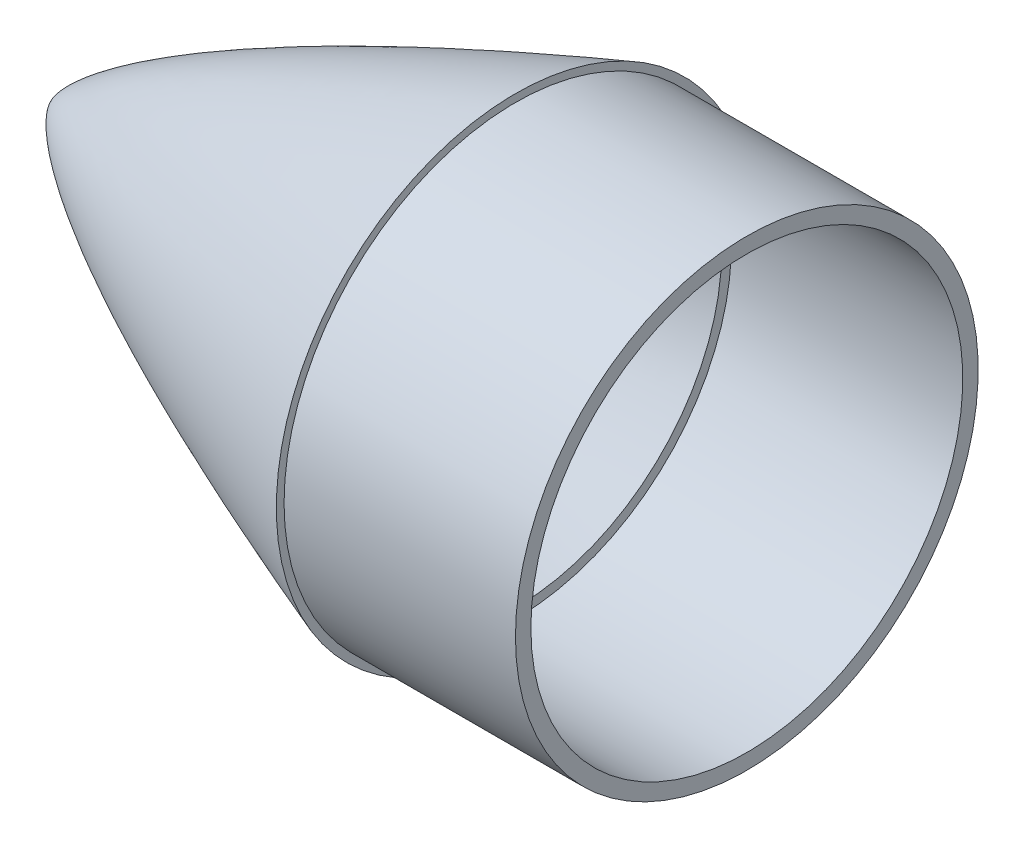
ISO-10303-21;
HEADER;
FILE_DESCRIPTION(('STEP AP214'),'2;1');
FILE_NAME('part.step','',(''),(''),'','','');
FILE_SCHEMA(('AUTOMOTIVE_DESIGN { 1 0 10303 214 1 1 1 1 }'));
ENDSEC;
DATA;
#1=APPLICATION_CONTEXT('core data for automotive mechanical design processes');
#2=APPLICATION_PROTOCOL_DEFINITION('international standard','automotive_design',2000,#1);
#3=PRODUCT_CONTEXT('',#1,'mechanical');
#4=PRODUCT('Part','Part','',(#3));
#5=PRODUCT_RELATED_PRODUCT_CATEGORY('part','',(#4));
#6=PRODUCT_DEFINITION_FORMATION('','',#4);
#7=PRODUCT_DEFINITION_CONTEXT('part definition',#1,'design');
#8=PRODUCT_DEFINITION('design','',#6,#7);
#9=PRODUCT_DEFINITION_SHAPE('','',#8);
#10=(LENGTH_UNIT() NAMED_UNIT(*) SI_UNIT(.MILLI.,.METRE.));
#11=(NAMED_UNIT(*) PLANE_ANGLE_UNIT() SI_UNIT($,.RADIAN.));
#12=(NAMED_UNIT(*) SI_UNIT($,.STERADIAN.) SOLID_ANGLE_UNIT());
#13=UNCERTAINTY_MEASURE_WITH_UNIT(LENGTH_MEASURE(1.E-05),#10,'distance_accuracy_value','');
#14=(GEOMETRIC_REPRESENTATION_CONTEXT(3) GLOBAL_UNCERTAINTY_ASSIGNED_CONTEXT((#13)) GLOBAL_UNIT_ASSIGNED_CONTEXT((#10,
#11,#12)) REPRESENTATION_CONTEXT('',''));
#15=CARTESIAN_POINT('',(0.,0.,0.));
#16=DIRECTION('',(0.,0.,1.));
#17=DIRECTION('',(1.,0.,0.));
#18=AXIS2_PLACEMENT_3D('',#15,#16,#17);
#19=CARTESIAN_POINT('',(76.1999999999997,0.,-39.3699999999999));
#20=CARTESIAN_POINT('',(75.512021251945,0.,-39.1211810194535));
#21=CARTESIAN_POINT('',(74.1291724300619,0.,-38.6189027327688));
#22=CARTESIAN_POINT('',(71.8689329940051,0.,-37.7932679402845));
#23=CARTESIAN_POINT('',(69.9241751916644,0.,-37.0714376385753));
#24=CARTESIAN_POINT('',(67.8818531571569,0.,-36.3114028490884));
#25=CARTESIAN_POINT('',(66.4857289447417,0.,-35.785661885191));
#26=CARTESIAN_POINT('',(64.9240952142326,0.,-35.1962690196107));
#27=CARTESIAN_POINT('',(63.4690517619626,0.,-34.6415303005477));
#28=CARTESIAN_POINT('',(61.9522422704689,0.,-34.0604471804305));
#29=CARTESIAN_POINT('',(60.4723410377972,0.,-33.4885936849193));
#30=CARTESIAN_POINT('',(58.6027189782495,0.,-32.7613343471186));
#31=CARTESIAN_POINT('',(56.3729888794564,0.,-31.8848889853544));
#32=CARTESIAN_POINT('',(53.02713839893,0.,-30.5526386645432));
#33=CARTESIAN_POINT('',(49.324564277146,0.,-29.0453786414619));
#34=CARTESIAN_POINT('',(45.6326545809091,0.,-27.5062189097851));
#35=CARTESIAN_POINT('',(41.221243199651,0.,-25.6181017873313));
#36=CARTESIAN_POINT('',(36.8286719181856,0.,-23.6848761841548));
#37=CARTESIAN_POINT('',(31.7371516999453,0.,-21.356065106434));
#38=CARTESIAN_POINT('',(25.9747404982944,0.,-18.5734502295125));
#39=CARTESIAN_POINT('',(20.2865486562202,0.,-15.6415766312331));
#40=CARTESIAN_POINT('',(15.1675421517009,0.,-12.7782380706891));
#41=CARTESIAN_POINT('',(10.8543641570435,0.,-10.1207828486482));
#42=CARTESIAN_POINT('',(7.48899398596335,0.,-7.80496147092249));
#43=CARTESIAN_POINT('',(5.15438008135244,0.,-6.01271086984692));
#44=CARTESIAN_POINT('',(3.47525665249411,0.,-4.56675307144145));
#45=CARTESIAN_POINT('',(2.28871812850204,0.,-3.41143406124871));
#46=CARTESIAN_POINT('',(1.47536495447122,0.,-2.51073938369411));
#47=CARTESIAN_POINT('',(0.928962798531295,0.,-1.81784398388637));
#48=CARTESIAN_POINT('',(0.569923857888038,0.,-1.29314253116738));
#49=CARTESIAN_POINT('',(0.336276313539511,0.,-0.895498064005422));
#50=CARTESIAN_POINT('',(0.188625397783366,0.,-0.599288616969163));
#51=CARTESIAN_POINT('',(0.100642452458188,0.,-0.387217509681647));
#52=CARTESIAN_POINT('',(0.0494973745169805,0.,-0.236880783950158));
#53=CARTESIAN_POINT('',(0.0199627979344898,0.,-0.127233999353693));
#54=CARTESIAN_POINT('',(0.00629066618589929,0.,-0.0615355825206517));
#55=CARTESIAN_POINT('',(0.00146658343557912,0.,-0.0205946092339539));
#56=CARTESIAN_POINT('',(0.,0.,0.));
#57=B_SPLINE_CURVE_WITH_KNOTS('',4,(#19,#20,#21,#22,#23,#24,#25,#26,#27,#28,#29,#30,#31,#32,#33,
#34,#35,#36,#37,#38,#39,#40,#41,#42,#43,#44,#45,#46,#47,#48,#49,#50,#51,#52,#53,#54,#55,#56),
.UNSPECIFIED.,.F.,.F.,(5,1,1,1,1,1,1,1,1,1,1,1,1,1,1,1,1,1,1,1,1,1,1,1,1,1,1,1,1,1,1,1,1,1,5),
(0.,0.0337293780250205,0.0674587560500409,0.0843234459907822,0.101188135931523,
0.118052825872265,0.134917515813006,0.151782205536431,0.168646895259857,0.185511584983282,
0.202376274706707,0.236105655952582,0.269835037198457,0.337293793140848,0.371023174364322,
0.404752555587796,0.472211308827977,0.539670077962256,0.607128819392485,0.674587579501533,
0.74204635596116,0.786963007794244,0.820692419834155,0.846796299453233,0.866109691266935,
0.880358300665193,0.890487816605047,0.897939230063102,0.903295697119764,0.907149716385882,
0.909923007762253,0.911885558588438,0.912971393313255,0.913841016032098,0.91471063875094),.UNSPECIFIED.);
#58=CARTESIAN_POINT('',(76.2,0.,0.));
#59=DIRECTION('',(1.,0.,0.));
#60=AXIS1_PLACEMENT('',#58,#59);
#61=SURFACE_OF_REVOLUTION('',#57,#60);
#62=CARTESIAN_POINT('',(0.,0.,0.));
#63=VERTEX_POINT('',#62);
#64=VERTEX_LOOP('',#63);
#65=FACE_BOUND('',#64,.T.);
#66=CARTESIAN_POINT('',(76.2,0.,0.));
#67=DIRECTION('',(1.,0.,0.));
#68=DIRECTION('',(0.,0.,-1.));
#69=AXIS2_PLACEMENT_3D('',#66,#67,#68);
#70=CIRCLE('',#69,39.37);
#71=CARTESIAN_POINT('',(76.2,0.,-39.37));
#72=VERTEX_POINT('',#71);
#73=EDGE_CURVE('E53',#72,#72,#70,.T.);
#74=ORIENTED_EDGE('',*,*,#73,.F.);
#75=EDGE_LOOP('',(#74));
#76=FACE_BOUND('',#75,.T.);
#77=ADVANCED_FACE('F45',(#65,#76),#61,.F.);
#78=CARTESIAN_POINT('',(76.2,0.,-39.37));
#79=DIRECTION('',(1.,0.,0.));
#80=DIRECTION('',(0.,0.,-1.));
#81=AXIS2_PLACEMENT_3D('',#78,#79,#80);
#82=PLANE('',#81);
#83=CARTESIAN_POINT('',(76.2,0.,0.));
#84=DIRECTION('',(1.,0.,0.));
#85=DIRECTION('',(0.,0.,-1.));
#86=AXIS2_PLACEMENT_3D('',#83,#84,#85);
#87=CIRCLE('',#86,38.1);
#88=CARTESIAN_POINT('',(76.2,0.,38.1));
#89=VERTEX_POINT('',#88);
#90=EDGE_CURVE('E73',#89,#89,#87,.T.);
#91=ORIENTED_EDGE('',*,*,#90,.F.);
#92=EDGE_LOOP('',(#91));
#93=FACE_BOUND('',#92,.T.);
#94=ORIENTED_EDGE('',*,*,#73,.T.);
#95=EDGE_LOOP('',(#94));
#96=FACE_BOUND('',#95,.T.);
#97=ADVANCED_FACE('F89',(#93,#96),#82,.T.);
#98=CARTESIAN_POINT('',(114.3,0.,0.));
#99=DIRECTION('',(1.,0.,0.));
#100=DIRECTION('',(0.,0.,-1.));
#101=AXIS2_PLACEMENT_3D('',#98,#99,#100);
#102=PLANE('',#101);
#103=CARTESIAN_POINT('',(114.3,0.,0.));
#104=DIRECTION('',(1.,0.,0.));
#105=DIRECTION('',(0.,0.,-1.));
#106=AXIS2_PLACEMENT_3D('',#103,#104,#105);
#107=CIRCLE('',#106,38.1);
#108=CARTESIAN_POINT('',(114.3,0.,38.1));
#109=VERTEX_POINT('',#108);
#110=EDGE_CURVE('E69',#109,#109,#107,.T.);
#111=ORIENTED_EDGE('',*,*,#110,.T.);
#112=EDGE_LOOP('',(#111));
#113=FACE_BOUND('',#112,.T.);
#114=CARTESIAN_POINT('',(114.3,0.,0.));
#115=DIRECTION('',(1.,0.,0.));
#116=DIRECTION('',(0.,0.,-1.));
#117=AXIS2_PLACEMENT_3D('',#114,#115,#116);
#118=CIRCLE('',#117,35.56);
#119=CARTESIAN_POINT('',(114.3,0.,35.56));
#120=VERTEX_POINT('',#119);
#121=EDGE_CURVE('E117',#120,#120,#118,.T.);
#122=ORIENTED_EDGE('',*,*,#121,.F.);
#123=EDGE_LOOP('',(#122));
#124=FACE_BOUND('',#123,.T.);
#125=ADVANCED_FACE('F91',(#113,#124),#102,.T.);
#126=CARTESIAN_POINT('',(114.3,0.,0.));
#127=DIRECTION('',(-1.,0.,0.));
#128=DIRECTION('',(0.,0.,1.));
#129=AXIS2_PLACEMENT_3D('',#126,#127,#128);
#130=CYLINDRICAL_SURFACE('',#129,38.1);
#131=CARTESIAN_POINT('',(114.3,0.,38.1));
#132=CARTESIAN_POINT('',(113.903125,0.,38.1));
#133=CARTESIAN_POINT('',(113.50625,0.,38.1));
#134=CARTESIAN_POINT('',(112.7125,0.,38.1));
#135=CARTESIAN_POINT('',(112.315625,0.,38.1));
#136=CARTESIAN_POINT('',(111.521875,0.,38.1));
#137=CARTESIAN_POINT('',(111.125,0.,38.1));
#138=CARTESIAN_POINT('',(110.33125,0.,38.1));
#139=CARTESIAN_POINT('',(109.934375,0.,38.1));
#140=CARTESIAN_POINT('',(109.140625,0.,38.1));
#141=CARTESIAN_POINT('',(108.74375,0.,38.1));
#142=CARTESIAN_POINT('',(107.95,0.,38.1));
#143=CARTESIAN_POINT('',(107.553125,0.,38.1));
#144=CARTESIAN_POINT('',(106.759375,0.,38.1));
#145=CARTESIAN_POINT('',(106.3625,0.,38.1));
#146=CARTESIAN_POINT('',(105.56875,0.,38.1));
#147=CARTESIAN_POINT('',(105.171875,0.,38.1));
#148=CARTESIAN_POINT('',(104.378125,0.,38.1));
#149=CARTESIAN_POINT('',(103.98125,0.,38.1));
#150=CARTESIAN_POINT('',(103.1875,0.,38.1));
#151=CARTESIAN_POINT('',(102.790625,0.,38.1));
#152=CARTESIAN_POINT('',(101.996875,0.,38.1));
#153=CARTESIAN_POINT('',(101.6,0.,38.1));
#154=CARTESIAN_POINT('',(100.80625,0.,38.1));
#155=CARTESIAN_POINT('',(100.409375,0.,38.1));
#156=CARTESIAN_POINT('',(99.615625,0.,38.1));
#157=CARTESIAN_POINT('',(99.21875,0.,38.1));
#158=CARTESIAN_POINT('',(98.425,0.,38.1));
#159=CARTESIAN_POINT('',(98.028125,0.,38.1));
#160=CARTESIAN_POINT('',(97.234375,0.,38.1));
#161=CARTESIAN_POINT('',(96.8375,0.,38.1));
#162=CARTESIAN_POINT('',(96.04375,0.,38.1));
#163=CARTESIAN_POINT('',(95.646875,0.,38.1));
#164=CARTESIAN_POINT('',(94.853125,0.,38.1));
#165=CARTESIAN_POINT('',(94.45625,0.,38.1));
#166=CARTESIAN_POINT('',(93.6625,0.,38.1));
#167=CARTESIAN_POINT('',(93.265625,0.,38.1));
#168=CARTESIAN_POINT('',(92.471875,0.,38.1));
#169=CARTESIAN_POINT('',(92.075,0.,38.1));
#170=CARTESIAN_POINT('',(91.28125,0.,38.1));
#171=CARTESIAN_POINT('',(90.884375,0.,38.1));
#172=CARTESIAN_POINT('',(90.090625,0.,38.1));
#173=CARTESIAN_POINT('',(89.69375,0.,38.1));
#174=CARTESIAN_POINT('',(88.9,0.,38.1));
#175=CARTESIAN_POINT('',(88.503125,0.,38.1));
#176=CARTESIAN_POINT('',(87.709375,0.,38.1));
#177=CARTESIAN_POINT('',(87.3125,0.,38.1));
#178=CARTESIAN_POINT('',(86.51875,0.,38.1));
#179=CARTESIAN_POINT('',(86.121875,0.,38.1));
#180=CARTESIAN_POINT('',(85.328125,0.,38.1));
#181=CARTESIAN_POINT('',(84.93125,0.,38.1));
#182=CARTESIAN_POINT('',(84.1375,0.,38.1));
#183=CARTESIAN_POINT('',(83.740625,0.,38.1));
#184=CARTESIAN_POINT('',(82.946875,0.,38.1));
#185=CARTESIAN_POINT('',(82.55,0.,38.1));
#186=CARTESIAN_POINT('',(81.75625,0.,38.1));
#187=CARTESIAN_POINT('',(81.359375,0.,38.1));
#188=CARTESIAN_POINT('',(80.565625,0.,38.1));
#189=CARTESIAN_POINT('',(80.16875,0.,38.1));
#190=CARTESIAN_POINT('',(79.375,0.,38.1));
#191=CARTESIAN_POINT('',(78.978125,0.,38.1));
#192=CARTESIAN_POINT('',(78.184375,0.,38.1));
#193=CARTESIAN_POINT('',(77.7875,0.,38.1));
#194=CARTESIAN_POINT('',(76.99375,0.,38.1));
#195=CARTESIAN_POINT('',(76.596875,0.,38.1));
#196=CARTESIAN_POINT('',(76.2,0.,38.1));
#197=B_SPLINE_CURVE_WITH_KNOTS('',3,(#131,#132,#133,#134,#135,#136,#137,#138,#139,#140,#141,
#142,#143,#144,#145,#146,#147,#148,#149,#150,#151,#152,#153,#154,#155,#156,#157,#158,#159,#160,
#161,#162,#163,#164,#165,#166,#167,#168,#169,#170,#171,#172,#173,#174,#175,#176,#177,#178,#179,
#180,#181,#182,#183,#184,#185,#186,#187,#188,#189,#190,#191,#192,#193,#194,#195,#196),
.UNSPECIFIED.,.F.,.F.,(4,2,2,2,2,2,2,2,2,2,2,2,2,2,2,2,2,2,2,2,2,2,2,2,2,2,2,2,2,2,2,2,4),(0.,
1.19062499999999,2.38124999999999,3.57187499999999,4.76249999999999,5.95312499999999,
7.14374999999999,8.33437499999999,9.52499999999999,10.715625,11.90625,13.096875,14.2875,
15.478125,16.66875,17.859375,19.05,20.240625,21.43125,22.621875,23.8125,25.003125,26.19375,
27.384375,28.575,29.765625,30.95625,32.146875,33.3375,34.528125,35.71875,36.909375,38.1),.UNSPECIFIED.);
#198=EDGE_CURVE('BSEAM96',#109,#89,#197,.T.);
#199=ORIENTED_EDGE('',*,*,#110,.F.);
#200=ORIENTED_EDGE('',*,*,#90,.T.);
#201=ORIENTED_EDGE('',*,*,#198,.T.);
#202=ORIENTED_EDGE('',*,*,#198,.F.);
#203=EDGE_LOOP('',(#199,#201,#200,#202));
#204=FACE_BOUND('',#203,.T.);
#205=ADVANCED_FACE('F96',(#204),#130,.T.);
#206=CARTESIAN_POINT('',(114.3,0.,0.));
#207=DIRECTION('',(-1.,0.,0.));
#208=DIRECTION('',(0.,0.,1.));
#209=AXIS2_PLACEMENT_3D('',#206,#207,#208);
#210=CYLINDRICAL_SURFACE('',#209,35.56);
#211=CARTESIAN_POINT('',(76.2,0.,0.));
#212=DIRECTION('',(1.,0.,0.));
#213=DIRECTION('',(0.,0.,-1.));
#214=AXIS2_PLACEMENT_3D('',#211,#212,#213);
#215=CIRCLE('',#214,35.56);
#216=CARTESIAN_POINT('',(76.2,0.,35.56));
#217=VERTEX_POINT('',#216);
#218=EDGE_CURVE('E12',#217,#217,#215,.F.);
#219=CARTESIAN_POINT('',(114.3,0.,35.56));
#220=CARTESIAN_POINT('',(113.903125,0.,35.56));
#221=CARTESIAN_POINT('',(113.50625,0.,35.56));
#222=CARTESIAN_POINT('',(112.7125,0.,35.56));
#223=CARTESIAN_POINT('',(112.315625,0.,35.56));
#224=CARTESIAN_POINT('',(111.521875,0.,35.56));
#225=CARTESIAN_POINT('',(111.125,0.,35.56));
#226=CARTESIAN_POINT('',(110.33125,0.,35.56));
#227=CARTESIAN_POINT('',(109.934375,0.,35.56));
#228=CARTESIAN_POINT('',(109.140625,0.,35.56));
#229=CARTESIAN_POINT('',(108.74375,0.,35.56));
#230=CARTESIAN_POINT('',(107.95,0.,35.56));
#231=CARTESIAN_POINT('',(107.553125,0.,35.56));
#232=CARTESIAN_POINT('',(106.759375,0.,35.56));
#233=CARTESIAN_POINT('',(106.3625,0.,35.56));
#234=CARTESIAN_POINT('',(105.56875,0.,35.56));
#235=CARTESIAN_POINT('',(105.171875,0.,35.56));
#236=CARTESIAN_POINT('',(104.378125,0.,35.56));
#237=CARTESIAN_POINT('',(103.98125,0.,35.56));
#238=CARTESIAN_POINT('',(103.1875,0.,35.56));
#239=CARTESIAN_POINT('',(102.790625,0.,35.56));
#240=CARTESIAN_POINT('',(101.996875,0.,35.56));
#241=CARTESIAN_POINT('',(101.6,0.,35.56));
#242=CARTESIAN_POINT('',(100.80625,0.,35.56));
#243=CARTESIAN_POINT('',(100.409375,0.,35.56));
#244=CARTESIAN_POINT('',(99.615625,0.,35.56));
#245=CARTESIAN_POINT('',(99.21875,0.,35.56));
#246=CARTESIAN_POINT('',(98.425,0.,35.56));
#247=CARTESIAN_POINT('',(98.028125,0.,35.56));
#248=CARTESIAN_POINT('',(97.234375,0.,35.56));
#249=CARTESIAN_POINT('',(96.8375,0.,35.56));
#250=CARTESIAN_POINT('',(96.04375,0.,35.56));
#251=CARTESIAN_POINT('',(95.646875,0.,35.56));
#252=CARTESIAN_POINT('',(94.853125,0.,35.56));
#253=CARTESIAN_POINT('',(94.45625,0.,35.56));
#254=CARTESIAN_POINT('',(93.6625,0.,35.56));
#255=CARTESIAN_POINT('',(93.265625,0.,35.56));
#256=CARTESIAN_POINT('',(92.471875,0.,35.56));
#257=CARTESIAN_POINT('',(92.075,0.,35.56));
#258=CARTESIAN_POINT('',(91.28125,0.,35.56));
#259=CARTESIAN_POINT('',(90.884375,0.,35.56));
#260=CARTESIAN_POINT('',(90.090625,0.,35.56));
#261=CARTESIAN_POINT('',(89.69375,0.,35.56));
#262=CARTESIAN_POINT('',(88.9,0.,35.56));
#263=CARTESIAN_POINT('',(88.503125,0.,35.56));
#264=CARTESIAN_POINT('',(87.709375,0.,35.56));
#265=CARTESIAN_POINT('',(87.3125,0.,35.56));
#266=CARTESIAN_POINT('',(86.51875,0.,35.56));
#267=CARTESIAN_POINT('',(86.121875,0.,35.56));
#268=CARTESIAN_POINT('',(85.328125,0.,35.56));
#269=CARTESIAN_POINT('',(84.93125,0.,35.56));
#270=CARTESIAN_POINT('',(84.1375,0.,35.56));
#271=CARTESIAN_POINT('',(83.740625,0.,35.56));
#272=CARTESIAN_POINT('',(82.946875,0.,35.56));
#273=CARTESIAN_POINT('',(82.55,0.,35.56));
#274=CARTESIAN_POINT('',(81.75625,0.,35.56));
#275=CARTESIAN_POINT('',(81.359375,0.,35.56));
#276=CARTESIAN_POINT('',(80.565625,0.,35.56));
#277=CARTESIAN_POINT('',(80.16875,0.,35.56));
#278=CARTESIAN_POINT('',(79.375,0.,35.56));
#279=CARTESIAN_POINT('',(78.978125,0.,35.56));
#280=CARTESIAN_POINT('',(78.184375,0.,35.56));
#281=CARTESIAN_POINT('',(77.7875,0.,35.56));
#282=CARTESIAN_POINT('',(76.99375,0.,35.56));
#283=CARTESIAN_POINT('',(76.596875,0.,35.56));
#284=CARTESIAN_POINT('',(76.2,0.,35.56));
#285=B_SPLINE_CURVE_WITH_KNOTS('',3,(#219,#220,#221,#222,#223,#224,#225,#226,#227,#228,#229,
#230,#231,#232,#233,#234,#235,#236,#237,#238,#239,#240,#241,#242,#243,#244,#245,#246,#247,#248,
#249,#250,#251,#252,#253,#254,#255,#256,#257,#258,#259,#260,#261,#262,#263,#264,#265,#266,#267,
#268,#269,#270,#271,#272,#273,#274,#275,#276,#277,#278,#279,#280,#281,#282,#283,#284),
.UNSPECIFIED.,.F.,.F.,(4,2,2,2,2,2,2,2,2,2,2,2,2,2,2,2,2,2,2,2,2,2,2,2,2,2,2,2,2,2,2,2,4),(0.,
1.19062499999999,2.38124999999999,3.57187499999999,4.76249999999999,5.95312499999999,
7.14374999999999,8.33437499999999,9.52499999999999,10.715625,11.90625,13.096875,14.2875,
15.478125,16.66875,17.859375,19.05,20.240625,21.43125,22.621875,23.8125,25.003125,26.19375,
27.384375,28.575,29.765625,30.95625,32.146875,33.3375,34.528125,35.71875,36.909375,38.1),.UNSPECIFIED.);
#286=EDGE_CURVE('BSEAM63',#120,#217,#285,.T.);
#287=ORIENTED_EDGE('',*,*,#121,.T.);
#288=ORIENTED_EDGE('',*,*,#218,.T.);
#289=ORIENTED_EDGE('',*,*,#286,.T.);
#290=ORIENTED_EDGE('',*,*,#286,.F.);
#291=EDGE_LOOP('',(#287,#289,#288,#290));
#292=FACE_BOUND('',#291,.T.);
#293=ADVANCED_FACE('F63',(#292),#210,.F.);
#294=CARTESIAN_POINT('',(76.1999999999997,0.,-39.3699999999999));
#295=CARTESIAN_POINT('',(75.512021251945,0.,-39.1211810194535));
#296=CARTESIAN_POINT('',(74.1291724300619,0.,-38.6189027327688));
#297=CARTESIAN_POINT('',(71.8689329940051,0.,-37.7932679402845));
#298=CARTESIAN_POINT('',(69.9241751916644,0.,-37.0714376385753));
#299=CARTESIAN_POINT('',(67.8818531571569,0.,-36.3114028490884));
#300=CARTESIAN_POINT('',(66.4857289447417,0.,-35.785661885191));
#301=CARTESIAN_POINT('',(64.9240952142326,0.,-35.1962690196107));
#302=CARTESIAN_POINT('',(63.4690517619626,0.,-34.6415303005477));
#303=CARTESIAN_POINT('',(61.9522422704689,0.,-34.0604471804305));
#304=CARTESIAN_POINT('',(60.4723410377972,0.,-33.4885936849193));
#305=CARTESIAN_POINT('',(58.6027189782495,0.,-32.7613343471186));
#306=CARTESIAN_POINT('',(56.3729888794564,0.,-31.8848889853544));
#307=CARTESIAN_POINT('',(53.02713839893,0.,-30.5526386645432));
#308=CARTESIAN_POINT('',(49.324564277146,0.,-29.0453786414619));
#309=CARTESIAN_POINT('',(45.6326545809091,0.,-27.5062189097851));
#310=CARTESIAN_POINT('',(41.221243199651,0.,-25.6181017873313));
#311=CARTESIAN_POINT('',(36.8286719181856,0.,-23.6848761841548));
#312=CARTESIAN_POINT('',(31.7371516999453,0.,-21.356065106434));
#313=CARTESIAN_POINT('',(25.9747404982944,0.,-18.5734502295125));
#314=CARTESIAN_POINT('',(20.2865486562202,0.,-15.6415766312331));
#315=CARTESIAN_POINT('',(15.1675421517009,0.,-12.7782380706891));
#316=CARTESIAN_POINT('',(10.8543641570435,0.,-10.1207828486482));
#317=CARTESIAN_POINT('',(7.48899398596335,0.,-7.80496147092249));
#318=CARTESIAN_POINT('',(5.15438008135244,0.,-6.01271086984692));
#319=CARTESIAN_POINT('',(3.69042162416678,0.,-4.75203990824375));
#320=CARTESIAN_POINT('',(2.87018165579672,0.,-3.97274104090755));
#321=CARTESIAN_POINT('',(2.50909476787772,0.,-3.60967931464176));
#322=CARTESIAN_POINT('',(2.47107413864979,0.,-3.57121522298984));
#323=B_SPLINE_CURVE_WITH_KNOTS('',4,(#294,#295,#296,#297,#298,#299,#300,#301,#302,#303,#304,
#305,#306,#307,#308,#309,#310,#311,#312,#313,#314,#315,#316,#317,#318,#319,#320,#321,#322),
.UNSPECIFIED.,.F.,.F.,(5,1,1,1,1,1,1,1,1,1,1,1,1,1,1,1,1,1,1,1,1,1,1,1,1,5),(0.,
0.0337293780250205,0.0674587560500409,0.0843234459907822,0.101188135931523,0.118052825872265,
0.134917515813006,0.151782205536431,0.168646895259857,0.185511584983282,0.202376274706707,
0.236105655952582,0.269835037198457,0.337293793140848,0.371023174364322,0.404752555587796,
0.472211308827977,0.539670077962256,0.607128819392485,0.674587579501533,0.74204635596116,
0.786963007794244,0.820692419834155,0.846796299453233,0.866109691266935,0.868390511282014),.UNSPECIFIED.);
#324=CARTESIAN_POINT('',(76.2,0.,0.));
#325=DIRECTION('',(1.,0.,0.));
#326=AXIS1_PLACEMENT('',#324,#325);
#327=SURFACE_OF_REVOLUTION('',#323,#326);
#328=OFFSET_SURFACE('',#327,5.08,.F.);
#329=CARTESIAN_POINT('',(6.08394305837074,0.,0.));
#330=VERTEX_POINT('',#329);
#331=VERTEX_LOOP('',#330);
#332=FACE_BOUND('',#331,.T.);
#333=CARTESIAN_POINT('',(76.2,0.,0.));
#334=DIRECTION('',(1.,0.,0.));
#335=DIRECTION('',(0.,0.,-1.));
#336=AXIS2_PLACEMENT_3D('',#333,#334,#335);
#337=CIRCLE('',#336,33.9655935403153);
#338=CARTESIAN_POINT('',(76.2,0.,-33.9655935403153));
#339=VERTEX_POINT('',#338);
#340=EDGE_CURVE('E67',#339,#339,#337,.T.);
#341=ORIENTED_EDGE('',*,*,#340,.T.);
#342=EDGE_LOOP('',(#341));
#343=FACE_BOUND('',#342,.T.);
#344=ADVANCED_FACE('F59',(#332,#343),#328,.T.);
#345=ORIENTED_EDGE('',*,*,#340,.F.);
#346=EDGE_LOOP('',(#345));
#347=FACE_BOUND('',#346,.T.);
#348=ORIENTED_EDGE('',*,*,#218,.F.);
#349=EDGE_LOOP('',(#348));
#350=FACE_BOUND('',#349,.T.);
#351=ADVANCED_FACE('F62',(#347,#350),#82,.T.);
#352=CLOSED_SHELL('',(#77,#97,#125,#205,#293,#344,#351));
#353=MANIFOLD_SOLID_BREP('B2',#352);
#354=ADVANCED_BREP_SHAPE_REPRESENTATION('',(#18,#353),#14);
#355=SHAPE_DEFINITION_REPRESENTATION(#9,#354);
ENDSEC;
END-ISO-10303-21;
